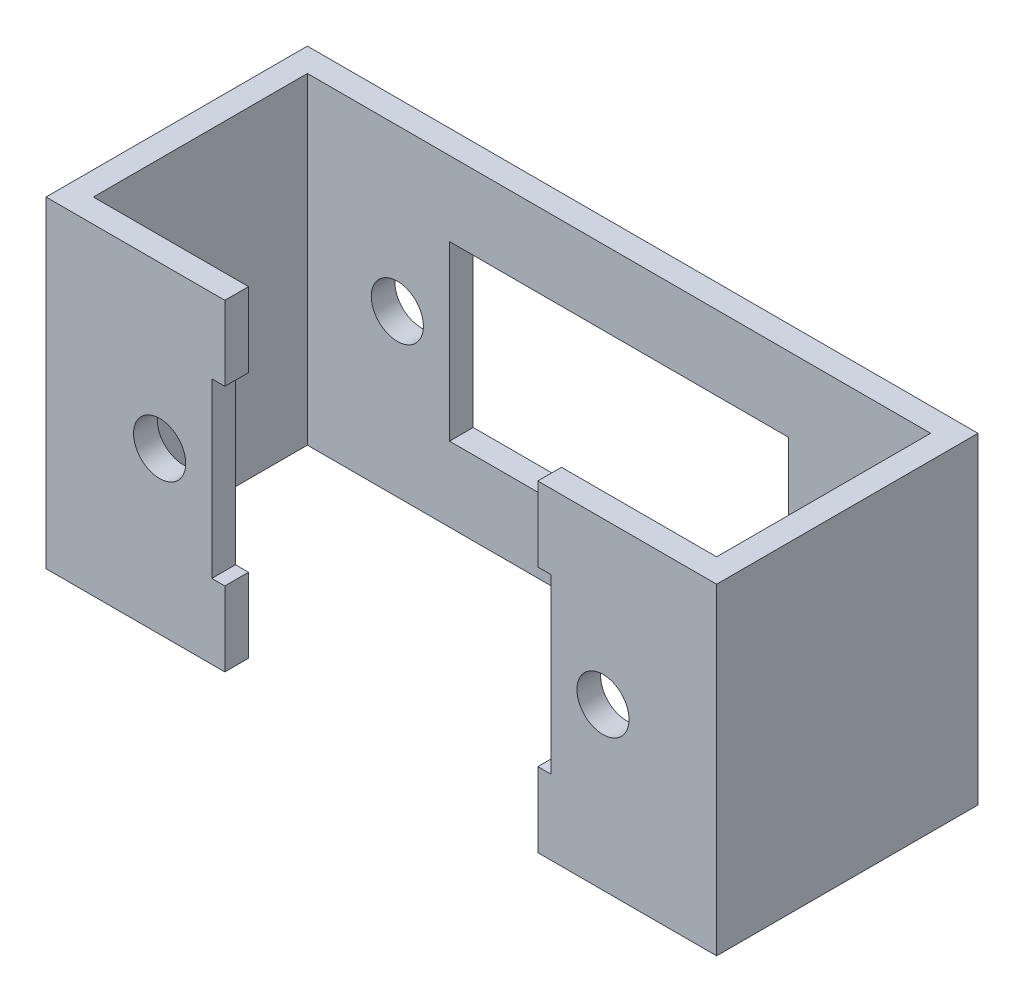
ISO-10303-21;
HEADER;
FILE_DESCRIPTION(('STEP AP214'),'2;1');
FILE_NAME('part.step','',(''),(''),'','','');
FILE_SCHEMA(('AUTOMOTIVE_DESIGN { 1 0 10303 214 1 1 1 1 }'));
ENDSEC;
DATA;
#1=APPLICATION_CONTEXT('core data for automotive mechanical design processes');
#2=APPLICATION_PROTOCOL_DEFINITION('international standard','automotive_design',2000,#1);
#3=PRODUCT_CONTEXT('',#1,'mechanical');
#4=PRODUCT('Part','Part','',(#3));
#5=PRODUCT_RELATED_PRODUCT_CATEGORY('part','',(#4));
#6=PRODUCT_DEFINITION_FORMATION('','',#4);
#7=PRODUCT_DEFINITION_CONTEXT('part definition',#1,'design');
#8=PRODUCT_DEFINITION('design','',#6,#7);
#9=PRODUCT_DEFINITION_SHAPE('','',#8);
#10=(LENGTH_UNIT() NAMED_UNIT(*) SI_UNIT(.MILLI.,.METRE.));
#11=(NAMED_UNIT(*) PLANE_ANGLE_UNIT() SI_UNIT($,.RADIAN.));
#12=(NAMED_UNIT(*) SI_UNIT($,.STERADIAN.) SOLID_ANGLE_UNIT());
#13=UNCERTAINTY_MEASURE_WITH_UNIT(LENGTH_MEASURE(1.E-05),#10,'distance_accuracy_value','');
#14=(GEOMETRIC_REPRESENTATION_CONTEXT(3) GLOBAL_UNCERTAINTY_ASSIGNED_CONTEXT((#13)) GLOBAL_UNIT_ASSIGNED_CONTEXT((#10,
#11,#12)) REPRESENTATION_CONTEXT('',''));
#15=CARTESIAN_POINT('',(0.,0.,0.));
#16=DIRECTION('',(0.,0.,1.));
#17=DIRECTION('',(1.,0.,0.));
#18=AXIS2_PLACEMENT_3D('',#15,#16,#17);
#19=CARTESIAN_POINT('',(-10.5,21.6,15.95));
#20=DIRECTION('',(-1.,0.,0.));
#21=DIRECTION('',(0.,0.,1.));
#22=AXIS2_PLACEMENT_3D('',#19,#20,#21);
#23=PLANE('',#22);
#24=DIRECTION('',(0.,-1.,0.));
#25=VECTOR('',#24,1.);
#26=CARTESIAN_POINT('',(-10.5,21.6,15.95));
#27=LINE('',#26,#25);
#28=CARTESIAN_POINT('',(-10.5,5.,15.95));
#29=VERTEX_POINT('',#28);
#30=CARTESIAN_POINT('',(-10.5,0.,15.95));
#31=VERTEX_POINT('',#30);
#32=EDGE_CURVE('E367',#29,#31,#27,.T.);
#33=ORIENTED_EDGE('',*,*,#32,.F.);
#34=DIRECTION('',(0.,0.,1.));
#35=VECTOR('',#34,1.);
#36=CARTESIAN_POINT('',(-10.5,5.,15.95));
#37=LINE('',#36,#35);
#38=CARTESIAN_POINT('',(-10.5,5.,17.54));
#39=VERTEX_POINT('',#38);
#40=EDGE_CURVE('E269',#29,#39,#37,.T.);
#41=ORIENTED_EDGE('',*,*,#40,.T.);
#42=DIRECTION('',(0.,-1.,0.));
#43=VECTOR('',#42,1.);
#44=CARTESIAN_POINT('',(-10.5,21.6,17.54));
#45=LINE('',#44,#43);
#46=CARTESIAN_POINT('',(-10.5,0.,17.54));
#47=VERTEX_POINT('',#46);
#48=EDGE_CURVE('E370',#39,#47,#45,.T.);
#49=ORIENTED_EDGE('',*,*,#48,.T.);
#50=DIRECTION('',(0.,0.,-1.));
#51=VECTOR('',#50,1.);
#52=CARTESIAN_POINT('',(-10.5,0.,15.95));
#53=LINE('',#52,#51);
#54=EDGE_CURVE('E317',#47,#31,#53,.T.);
#55=ORIENTED_EDGE('',*,*,#54,.T.);
#56=EDGE_LOOP('',(#33,#41,#49,#55));
#57=FACE_BOUND('',#56,.T.);
#58=ADVANCED_FACE('F32',(#57),#23,.F.);
#59=CARTESIAN_POINT('',(10.5,21.6,17.54));
#60=DIRECTION('',(1.,0.,0.));
#61=DIRECTION('',(0.,0.,-1.));
#62=AXIS2_PLACEMENT_3D('',#59,#60,#61);
#63=PLANE('',#62);
#64=DIRECTION('',(0.,-1.,0.));
#65=VECTOR('',#64,1.);
#66=CARTESIAN_POINT('',(10.5,21.6,17.54));
#67=LINE('',#66,#65);
#68=CARTESIAN_POINT('',(10.5,5.,17.54));
#69=VERTEX_POINT('',#68);
#70=CARTESIAN_POINT('',(10.5,0.,17.54));
#71=VERTEX_POINT('',#70);
#72=EDGE_CURVE('E347',#69,#71,#67,.T.);
#73=ORIENTED_EDGE('',*,*,#72,.F.);
#74=DIRECTION('',(0.,0.,-1.));
#75=VECTOR('',#74,1.);
#76=CARTESIAN_POINT('',(10.5,5.,17.54));
#77=LINE('',#76,#75);
#78=CARTESIAN_POINT('',(10.5,5.,15.95));
#79=VERTEX_POINT('',#78);
#80=EDGE_CURVE('E257',#69,#79,#77,.T.);
#81=ORIENTED_EDGE('',*,*,#80,.T.);
#82=DIRECTION('',(0.,-1.,0.));
#83=VECTOR('',#82,1.);
#84=CARTESIAN_POINT('',(10.5,21.6,15.95));
#85=LINE('',#84,#83);
#86=CARTESIAN_POINT('',(10.5,0.,15.95));
#87=VERTEX_POINT('',#86);
#88=EDGE_CURVE('E351',#79,#87,#85,.T.);
#89=ORIENTED_EDGE('',*,*,#88,.T.);
#90=DIRECTION('',(0.,0.,1.));
#91=VECTOR('',#90,1.);
#92=CARTESIAN_POINT('',(10.5,0.,17.54));
#93=LINE('',#92,#91);
#94=EDGE_CURVE('E331',#87,#71,#93,.T.);
#95=ORIENTED_EDGE('',*,*,#94,.T.);
#96=EDGE_LOOP('',(#73,#81,#89,#95));
#97=FACE_BOUND('',#96,.T.);
#98=ADVANCED_FACE('F430',(#97),#63,.F.);
#99=CARTESIAN_POINT('',(-22.5,21.6,17.54));
#100=DIRECTION('',(1.,0.,0.));
#101=DIRECTION('',(0.,0.,-1.));
#102=AXIS2_PLACEMENT_3D('',#99,#100,#101);
#103=PLANE('',#102);
#104=DIRECTION('',(0.,0.,1.));
#105=VECTOR('',#104,1.);
#106=CARTESIAN_POINT('',(-22.5,0.,17.54));
#107=LINE('',#106,#105);
#108=CARTESIAN_POINT('',(-22.5,0.,0.));
#109=VERTEX_POINT('',#108);
#110=CARTESIAN_POINT('',(-22.5,0.,17.54));
#111=VERTEX_POINT('',#110);
#112=EDGE_CURVE('E284',#109,#111,#107,.T.);
#113=ORIENTED_EDGE('',*,*,#112,.T.);
#114=DIRECTION('',(0.,-1.,0.));
#115=VECTOR('',#114,1.);
#116=CARTESIAN_POINT('',(-22.5,21.6,17.54));
#117=LINE('',#116,#115);
#118=CARTESIAN_POINT('',(-22.5,21.6,17.54));
#119=VERTEX_POINT('',#118);
#120=EDGE_CURVE('E11',#119,#111,#117,.T.);
#121=ORIENTED_EDGE('',*,*,#120,.F.);
#122=DIRECTION('',(0.,0.,1.));
#123=VECTOR('',#122,1.);
#124=CARTESIAN_POINT('',(-22.5,21.6,17.54));
#125=LINE('',#124,#123);
#126=CARTESIAN_POINT('',(-22.5,21.6,0.));
#127=VERTEX_POINT('',#126);
#128=EDGE_CURVE('E285',#127,#119,#125,.T.);
#129=ORIENTED_EDGE('',*,*,#128,.F.);
#130=DIRECTION('',(0.,-1.,0.));
#131=VECTOR('',#130,1.);
#132=CARTESIAN_POINT('',(-22.5,21.6,0.));
#133=LINE('',#132,#131);
#134=EDGE_CURVE('E311',#127,#109,#133,.T.);
#135=ORIENTED_EDGE('',*,*,#134,.T.);
#136=EDGE_LOOP('',(#113,#121,#129,#135));
#137=FACE_BOUND('',#136,.T.);
#138=ADVANCED_FACE('F34',(#137),#103,.F.);
#139=CARTESIAN_POINT('',(-10.5,21.6,17.54));
#140=DIRECTION('',(0.,0.,-1.));
#141=DIRECTION('',(-1.,0.,0.));
#142=AXIS2_PLACEMENT_3D('',#139,#140,#141);
#143=PLANE('',#142);
#144=CARTESIAN_POINT('',(-14.875,10.8,17.54));
#145=DIRECTION('',(0.,0.,-1.));
#146=DIRECTION('',(-1.,0.,0.));
#147=AXIS2_PLACEMENT_3D('',#144,#145,#146);
#148=CIRCLE('',#147,1.75);
#149=CARTESIAN_POINT('',(-16.625,10.8,17.54));
#150=VERTEX_POINT('',#149);
#151=EDGE_CURVE('E452',#150,#150,#148,.T.);
#152=ORIENTED_EDGE('',*,*,#151,.T.);
#153=EDGE_LOOP('',(#152));
#154=FACE_BOUND('',#153,.T.);
#155=ORIENTED_EDGE('',*,*,#48,.F.);
#156=DIRECTION('',(-1.,0.,0.));
#157=VECTOR('',#156,1.);
#158=CARTESIAN_POINT('',(-10.5,5.,17.54));
#159=LINE('',#158,#157);
#160=CARTESIAN_POINT('',(-11.375,5.,17.54));
#161=VERTEX_POINT('',#160);
#162=EDGE_CURVE('E272',#39,#161,#159,.T.);
#163=ORIENTED_EDGE('',*,*,#162,.T.);
#164=DIRECTION('',(0.,1.,0.));
#165=VECTOR('',#164,1.);
#166=CARTESIAN_POINT('',(-11.375,21.6,17.54));
#167=LINE('',#166,#165);
#168=CARTESIAN_POINT('',(-11.375,16.6,17.54));
#169=VERTEX_POINT('',#168);
#170=EDGE_CURVE('E281',#161,#169,#167,.T.);
#171=ORIENTED_EDGE('',*,*,#170,.T.);
#172=DIRECTION('',(1.,0.,0.));
#173=VECTOR('',#172,1.);
#174=CARTESIAN_POINT('',(-10.5,16.6,17.54));
#175=LINE('',#174,#173);
#176=CARTESIAN_POINT('',(-10.5,16.6,17.54));
#177=VERTEX_POINT('',#176);
#178=EDGE_CURVE('E244',#169,#177,#175,.T.);
#179=ORIENTED_EDGE('',*,*,#178,.T.);
#180=CARTESIAN_POINT('',(-10.5,21.6,17.54));
#181=VERTEX_POINT('',#180);
#182=EDGE_CURVE('E40',#181,#177,#45,.T.);
#183=ORIENTED_EDGE('',*,*,#182,.F.);
#184=DIRECTION('',(1.,0.,0.));
#185=VECTOR('',#184,1.);
#186=CARTESIAN_POINT('',(-10.5,21.6,17.54));
#187=LINE('',#186,#185);
#188=EDGE_CURVE('E288',#119,#181,#187,.T.);
#189=ORIENTED_EDGE('',*,*,#188,.F.);
#190=ORIENTED_EDGE('',*,*,#120,.T.);
#191=DIRECTION('',(1.,0.,0.));
#192=VECTOR('',#191,1.);
#193=CARTESIAN_POINT('',(-10.5,0.,17.54));
#194=LINE('',#193,#192);
#195=EDGE_CURVE('E314',#111,#47,#194,.T.);
#196=ORIENTED_EDGE('',*,*,#195,.T.);
#197=EDGE_LOOP('',(#155,#163,#171,#179,#183,#189,#190,#196));
#198=FACE_BOUND('',#197,.T.);
#199=ADVANCED_FACE('F381',(#154,#198),#143,.F.);
#200=ORIENTED_EDGE('',*,*,#182,.T.);
#201=DIRECTION('',(0.,0.,-1.));
#202=VECTOR('',#201,1.);
#203=CARTESIAN_POINT('',(-10.5,16.6,15.95));
#204=LINE('',#203,#202);
#205=CARTESIAN_POINT('',(-10.5,16.6,15.95));
#206=VERTEX_POINT('',#205);
#207=EDGE_CURVE('E241',#177,#206,#204,.T.);
#208=ORIENTED_EDGE('',*,*,#207,.T.);
#209=CARTESIAN_POINT('',(-10.5,21.6,15.95));
#210=VERTEX_POINT('',#209);
#211=EDGE_CURVE('E368',#210,#206,#27,.T.);
#212=ORIENTED_EDGE('',*,*,#211,.F.);
#213=DIRECTION('',(0.,0.,-1.));
#214=VECTOR('',#213,1.);
#215=CARTESIAN_POINT('',(-10.5,21.6,15.95));
#216=LINE('',#215,#214);
#217=EDGE_CURVE('E291',#181,#210,#216,.T.);
#218=ORIENTED_EDGE('',*,*,#217,.F.);
#219=EDGE_LOOP('',(#200,#208,#212,#218));
#220=FACE_BOUND('',#219,.T.);
#221=ADVANCED_FACE('F401',(#220),#23,.F.);
#222=CARTESIAN_POINT('',(-20.91,21.6,15.95));
#223=DIRECTION('',(0.,0.,1.));
#224=DIRECTION('',(1.,0.,0.));
#225=AXIS2_PLACEMENT_3D('',#222,#223,#224);
#226=PLANE('',#225);
#227=CARTESIAN_POINT('',(-14.875,10.8,15.95));
#228=DIRECTION('',(0.,0.,1.));
#229=DIRECTION('',(1.,0.,0.));
#230=AXIS2_PLACEMENT_3D('',#227,#228,#229);
#231=CIRCLE('',#230,1.75);
#232=CARTESIAN_POINT('',(-16.625,10.8,15.95));
#233=VERTEX_POINT('',#232);
#234=EDGE_CURVE('E455',#233,#233,#231,.T.);
#235=ORIENTED_EDGE('',*,*,#234,.T.);
#236=EDGE_LOOP('',(#235));
#237=FACE_BOUND('',#236,.T.);
#238=DIRECTION('',(0.,-1.,0.));
#239=VECTOR('',#238,1.);
#240=CARTESIAN_POINT('',(-11.375,21.6,15.95));
#241=LINE('',#240,#239);
#242=CARTESIAN_POINT('',(-11.375,16.6,15.95));
#243=VERTEX_POINT('',#242);
#244=CARTESIAN_POINT('',(-11.375,5.,15.95));
#245=VERTEX_POINT('',#244);
#246=EDGE_CURVE('E278',#243,#245,#241,.T.);
#247=ORIENTED_EDGE('',*,*,#246,.T.);
#248=DIRECTION('',(1.,0.,0.));
#249=VECTOR('',#248,1.);
#250=CARTESIAN_POINT('',(-20.91,5.,15.95));
#251=LINE('',#250,#249);
#252=EDGE_CURVE('E266',#245,#29,#251,.T.);
#253=ORIENTED_EDGE('',*,*,#252,.T.);
#254=ORIENTED_EDGE('',*,*,#32,.T.);
#255=DIRECTION('',(-1.,0.,0.));
#256=VECTOR('',#255,1.);
#257=CARTESIAN_POINT('',(-20.91,0.,15.95));
#258=LINE('',#257,#256);
#259=CARTESIAN_POINT('',(-20.91,0.,15.95));
#260=VERTEX_POINT('',#259);
#261=EDGE_CURVE('E320',#31,#260,#258,.T.);
#262=ORIENTED_EDGE('',*,*,#261,.T.);
#263=DIRECTION('',(0.,-1.,0.));
#264=VECTOR('',#263,1.);
#265=CARTESIAN_POINT('',(-20.91,21.6,15.95));
#266=LINE('',#265,#264);
#267=CARTESIAN_POINT('',(-20.91,21.6,15.95));
#268=VERTEX_POINT('',#267);
#269=EDGE_CURVE('E364',#268,#260,#266,.T.);
#270=ORIENTED_EDGE('',*,*,#269,.F.);
#271=DIRECTION('',(-1.,0.,0.));
#272=VECTOR('',#271,1.);
#273=CARTESIAN_POINT('',(-20.91,21.6,15.95));
#274=LINE('',#273,#272);
#275=EDGE_CURVE('E293',#210,#268,#274,.T.);
#276=ORIENTED_EDGE('',*,*,#275,.F.);
#277=ORIENTED_EDGE('',*,*,#211,.T.);
#278=DIRECTION('',(-1.,0.,0.));
#279=VECTOR('',#278,1.);
#280=CARTESIAN_POINT('',(-20.91,16.6,15.95));
#281=LINE('',#280,#279);
#282=EDGE_CURVE('E238',#206,#243,#281,.T.);
#283=ORIENTED_EDGE('',*,*,#282,.T.);
#284=EDGE_LOOP('',(#247,#253,#254,#262,#270,#276,#277,#283));
#285=FACE_BOUND('',#284,.T.);
#286=ADVANCED_FACE('F390',(#237,#285),#226,.F.);
#287=CARTESIAN_POINT('',(-20.91,21.6,1.59));
#288=DIRECTION('',(-1.,0.,0.));
#289=DIRECTION('',(0.,0.,1.));
#290=AXIS2_PLACEMENT_3D('',#287,#288,#289);
#291=PLANE('',#290);
#292=DIRECTION('',(0.,0.,-1.));
#293=VECTOR('',#292,1.);
#294=CARTESIAN_POINT('',(-20.91,0.,1.59));
#295=LINE('',#294,#293);
#296=CARTESIAN_POINT('',(-20.91,0.,1.59));
#297=VERTEX_POINT('',#296);
#298=EDGE_CURVE('E322',#260,#297,#295,.T.);
#299=ORIENTED_EDGE('',*,*,#298,.T.);
#300=DIRECTION('',(0.,-1.,0.));
#301=VECTOR('',#300,1.);
#302=CARTESIAN_POINT('',(-20.91,21.6,1.59));
#303=LINE('',#302,#301);
#304=CARTESIAN_POINT('',(-20.91,21.6,1.59));
#305=VERTEX_POINT('',#304);
#306=EDGE_CURVE('E361',#305,#297,#303,.T.);
#307=ORIENTED_EDGE('',*,*,#306,.F.);
#308=DIRECTION('',(0.,0.,-1.));
#309=VECTOR('',#308,1.);
#310=CARTESIAN_POINT('',(-20.91,21.6,1.59));
#311=LINE('',#310,#309);
#312=EDGE_CURVE('E295',#268,#305,#311,.T.);
#313=ORIENTED_EDGE('',*,*,#312,.F.);
#314=ORIENTED_EDGE('',*,*,#269,.T.);
#315=EDGE_LOOP('',(#299,#307,#313,#314));
#316=FACE_BOUND('',#315,.T.);
#317=ADVANCED_FACE('F394',(#316),#291,.F.);
#318=CARTESIAN_POINT('',(20.91,21.6,1.59));
#319=DIRECTION('',(0.,0.,-1.));
#320=DIRECTION('',(-1.,0.,0.));
#321=AXIS2_PLACEMENT_3D('',#318,#319,#320);
#322=PLANE('',#321);
#323=CARTESIAN_POINT('',(14.875,10.8,1.59));
#324=DIRECTION('',(0.,0.,-1.));
#325=DIRECTION('',(-1.,0.,0.));
#326=AXIS2_PLACEMENT_3D('',#323,#324,#325);
#327=CIRCLE('',#326,1.75);
#328=CARTESIAN_POINT('',(13.125,10.8,1.59));
#329=VERTEX_POINT('',#328);
#330=EDGE_CURVE('E467',#329,#329,#327,.T.);
#331=ORIENTED_EDGE('',*,*,#330,.T.);
#332=EDGE_LOOP('',(#331));
#333=FACE_BOUND('',#332,.T.);
#334=CARTESIAN_POINT('',(-14.875,10.8,1.59));
#335=DIRECTION('',(0.,0.,-1.));
#336=DIRECTION('',(-1.,0.,0.));
#337=AXIS2_PLACEMENT_3D('',#334,#335,#336);
#338=CIRCLE('',#337,1.75);
#339=CARTESIAN_POINT('',(-16.625,10.8,1.59));
#340=VERTEX_POINT('',#339);
#341=EDGE_CURVE('E461',#340,#340,#338,.T.);
#342=ORIENTED_EDGE('',*,*,#341,.T.);
#343=EDGE_LOOP('',(#342));
#344=FACE_BOUND('',#343,.T.);
#345=DIRECTION('',(-1.,0.,0.));
#346=VECTOR('',#345,1.);
#347=CARTESIAN_POINT('',(20.91,5.,1.59));
#348=LINE('',#347,#346);
#349=CARTESIAN_POINT('',(11.375,5.,1.59));
#350=VERTEX_POINT('',#349);
#351=CARTESIAN_POINT('',(-11.375,5.,1.59));
#352=VERTEX_POINT('',#351);
#353=EDGE_CURVE('E263',#350,#352,#348,.T.);
#354=ORIENTED_EDGE('',*,*,#353,.T.);
#355=DIRECTION('',(0.,1.,0.));
#356=VECTOR('',#355,1.);
#357=CARTESIAN_POINT('',(-11.375,21.6,1.59));
#358=LINE('',#357,#356);
#359=CARTESIAN_POINT('',(-11.375,16.6,1.59));
#360=VERTEX_POINT('',#359);
#361=EDGE_CURVE('E275',#352,#360,#358,.T.);
#362=ORIENTED_EDGE('',*,*,#361,.T.);
#363=DIRECTION('',(1.,0.,0.));
#364=VECTOR('',#363,1.);
#365=CARTESIAN_POINT('',(20.91,16.6,1.59));
#366=LINE('',#365,#364);
#367=CARTESIAN_POINT('',(11.375,16.6,1.59));
#368=VERTEX_POINT('',#367);
#369=EDGE_CURVE('E236',#360,#368,#366,.T.);
#370=ORIENTED_EDGE('',*,*,#369,.T.);
#371=DIRECTION('',(0.,-1.,0.));
#372=VECTOR('',#371,1.);
#373=CARTESIAN_POINT('',(11.375,21.6,1.59));
#374=LINE('',#373,#372);
#375=EDGE_CURVE('E198',#368,#350,#374,.T.);
#376=ORIENTED_EDGE('',*,*,#375,.T.);
#377=EDGE_LOOP('',(#354,#362,#370,#376));
#378=FACE_BOUND('',#377,.T.);
#379=DIRECTION('',(1.,0.,0.));
#380=VECTOR('',#379,1.);
#381=CARTESIAN_POINT('',(20.91,0.,1.59));
#382=LINE('',#381,#380);
#383=CARTESIAN_POINT('',(20.91,0.,1.59));
#384=VERTEX_POINT('',#383);
#385=EDGE_CURVE('E324',#297,#384,#382,.T.);
#386=ORIENTED_EDGE('',*,*,#385,.T.);
#387=DIRECTION('',(0.,-1.,0.));
#388=VECTOR('',#387,1.);
#389=CARTESIAN_POINT('',(20.91,21.6,1.59));
#390=LINE('',#389,#388);
#391=CARTESIAN_POINT('',(20.91,21.6,1.59));
#392=VERTEX_POINT('',#391);
#393=EDGE_CURVE('E358',#392,#384,#390,.T.);
#394=ORIENTED_EDGE('',*,*,#393,.F.);
#395=DIRECTION('',(1.,0.,0.));
#396=VECTOR('',#395,1.);
#397=CARTESIAN_POINT('',(20.91,21.6,1.59));
#398=LINE('',#397,#396);
#399=EDGE_CURVE('E297',#305,#392,#398,.T.);
#400=ORIENTED_EDGE('',*,*,#399,.F.);
#401=ORIENTED_EDGE('',*,*,#306,.T.);
#402=EDGE_LOOP('',(#386,#394,#400,#401));
#403=FACE_BOUND('',#402,.T.);
#404=ADVANCED_FACE('F472',(#333,#344,#378,#403),#322,.F.);
#405=CARTESIAN_POINT('',(20.91,21.6,15.95));
#406=DIRECTION('',(1.,0.,0.));
#407=DIRECTION('',(0.,0.,-1.));
#408=AXIS2_PLACEMENT_3D('',#405,#406,#407);
#409=PLANE('',#408);
#410=DIRECTION('',(0.,0.,1.));
#411=VECTOR('',#410,1.);
#412=CARTESIAN_POINT('',(20.91,0.,15.95));
#413=LINE('',#412,#411);
#414=CARTESIAN_POINT('',(20.91,0.,15.95));
#415=VERTEX_POINT('',#414);
#416=EDGE_CURVE('E326',#384,#415,#413,.T.);
#417=ORIENTED_EDGE('',*,*,#416,.T.);
#418=DIRECTION('',(0.,-1.,0.));
#419=VECTOR('',#418,1.);
#420=CARTESIAN_POINT('',(20.91,21.6,15.95));
#421=LINE('',#420,#419);
#422=CARTESIAN_POINT('',(20.91,21.6,15.95));
#423=VERTEX_POINT('',#422);
#424=EDGE_CURVE('E355',#423,#415,#421,.T.);
#425=ORIENTED_EDGE('',*,*,#424,.F.);
#426=DIRECTION('',(0.,0.,1.));
#427=VECTOR('',#426,1.);
#428=CARTESIAN_POINT('',(20.91,21.6,15.95));
#429=LINE('',#428,#427);
#430=EDGE_CURVE('E299',#392,#423,#429,.T.);
#431=ORIENTED_EDGE('',*,*,#430,.F.);
#432=ORIENTED_EDGE('',*,*,#393,.T.);
#433=EDGE_LOOP('',(#417,#425,#431,#432));
#434=FACE_BOUND('',#433,.T.);
#435=ADVANCED_FACE('F475',(#434),#409,.F.);
#436=CARTESIAN_POINT('',(10.5,21.6,15.95));
#437=DIRECTION('',(0.,0.,1.));
#438=DIRECTION('',(1.,0.,0.));
#439=AXIS2_PLACEMENT_3D('',#436,#437,#438);
#440=PLANE('',#439);
#441=CARTESIAN_POINT('',(14.875,10.8,15.95));
#442=DIRECTION('',(0.,0.,1.));
#443=DIRECTION('',(1.,0.,0.));
#444=AXIS2_PLACEMENT_3D('',#441,#442,#443);
#445=CIRCLE('',#444,1.75);
#446=CARTESIAN_POINT('',(16.625,10.8,15.95));
#447=VERTEX_POINT('',#446);
#448=EDGE_CURVE('E458',#447,#447,#445,.T.);
#449=ORIENTED_EDGE('',*,*,#448,.T.);
#450=EDGE_LOOP('',(#449));
#451=FACE_BOUND('',#450,.T.);
#452=ORIENTED_EDGE('',*,*,#88,.F.);
#453=DIRECTION('',(1.,0.,0.));
#454=VECTOR('',#453,1.);
#455=CARTESIAN_POINT('',(10.5,5.,15.95));
#456=LINE('',#455,#454);
#457=CARTESIAN_POINT('',(11.375,5.,15.95));
#458=VERTEX_POINT('',#457);
#459=EDGE_CURVE('E260',#79,#458,#456,.T.);
#460=ORIENTED_EDGE('',*,*,#459,.T.);
#461=DIRECTION('',(0.,1.,0.));
#462=VECTOR('',#461,1.);
#463=CARTESIAN_POINT('',(11.375,21.6,15.95));
#464=LINE('',#463,#462);
#465=CARTESIAN_POINT('',(11.375,16.6,15.95));
#466=VERTEX_POINT('',#465);
#467=EDGE_CURVE('E250',#458,#466,#464,.T.);
#468=ORIENTED_EDGE('',*,*,#467,.T.);
#469=DIRECTION('',(-1.,0.,0.));
#470=VECTOR('',#469,1.);
#471=CARTESIAN_POINT('',(10.5,16.6,15.95));
#472=LINE('',#471,#470);
#473=CARTESIAN_POINT('',(10.5,16.6,15.95));
#474=VERTEX_POINT('',#473);
#475=EDGE_CURVE('E233',#466,#474,#472,.T.);
#476=ORIENTED_EDGE('',*,*,#475,.T.);
#477=CARTESIAN_POINT('',(10.5,21.6,15.95));
#478=VERTEX_POINT('',#477);
#479=EDGE_CURVE('E352',#478,#474,#85,.T.);
#480=ORIENTED_EDGE('',*,*,#479,.F.);
#481=DIRECTION('',(-1.,0.,0.));
#482=VECTOR('',#481,1.);
#483=CARTESIAN_POINT('',(10.5,21.6,15.95));
#484=LINE('',#483,#482);
#485=EDGE_CURVE('E301',#423,#478,#484,.T.);
#486=ORIENTED_EDGE('',*,*,#485,.F.);
#487=ORIENTED_EDGE('',*,*,#424,.T.);
#488=DIRECTION('',(-1.,0.,0.));
#489=VECTOR('',#488,1.);
#490=CARTESIAN_POINT('',(10.5,0.,15.95));
#491=LINE('',#490,#489);
#492=EDGE_CURVE('E328',#415,#87,#491,.T.);
#493=ORIENTED_EDGE('',*,*,#492,.T.);
#494=EDGE_LOOP('',(#452,#460,#468,#476,#480,#486,#487,#493));
#495=FACE_BOUND('',#494,.T.);
#496=ADVANCED_FACE('F487',(#451,#495),#440,.F.);
#497=ORIENTED_EDGE('',*,*,#479,.T.);
#498=DIRECTION('',(0.,0.,1.));
#499=VECTOR('',#498,1.);
#500=CARTESIAN_POINT('',(10.5,16.6,17.54));
#501=LINE('',#500,#499);
#502=CARTESIAN_POINT('',(10.5,16.6,17.54));
#503=VERTEX_POINT('',#502);
#504=EDGE_CURVE('E230',#474,#503,#501,.T.);
#505=ORIENTED_EDGE('',*,*,#504,.T.);
#506=CARTESIAN_POINT('',(10.5,21.6,17.54));
#507=VERTEX_POINT('',#506);
#508=EDGE_CURVE('E348',#507,#503,#67,.T.);
#509=ORIENTED_EDGE('',*,*,#508,.F.);
#510=DIRECTION('',(0.,0.,1.));
#511=VECTOR('',#510,1.);
#512=CARTESIAN_POINT('',(10.5,21.6,17.54));
#513=LINE('',#512,#511);
#514=EDGE_CURVE('E303',#478,#507,#513,.T.);
#515=ORIENTED_EDGE('',*,*,#514,.F.);
#516=EDGE_LOOP('',(#497,#505,#509,#515));
#517=FACE_BOUND('',#516,.T.);
#518=ADVANCED_FACE('F437',(#517),#63,.F.);
#519=CARTESIAN_POINT('',(22.5,21.6,17.54));
#520=DIRECTION('',(0.,0.,-1.));
#521=DIRECTION('',(-1.,0.,0.));
#522=AXIS2_PLACEMENT_3D('',#519,#520,#521);
#523=PLANE('',#522);
#524=CARTESIAN_POINT('',(14.875,10.8,17.54));
#525=DIRECTION('',(0.,0.,-1.));
#526=DIRECTION('',(-1.,0.,0.));
#527=AXIS2_PLACEMENT_3D('',#524,#525,#526);
#528=CIRCLE('',#527,1.75);
#529=CARTESIAN_POINT('',(13.125,10.8,17.54));
#530=VERTEX_POINT('',#529);
#531=EDGE_CURVE('E454',#530,#530,#528,.T.);
#532=ORIENTED_EDGE('',*,*,#531,.T.);
#533=EDGE_LOOP('',(#532));
#534=FACE_BOUND('',#533,.T.);
#535=DIRECTION('',(0.,-1.,0.));
#536=VECTOR('',#535,1.);
#537=CARTESIAN_POINT('',(11.375,21.6,17.54));
#538=LINE('',#537,#536);
#539=CARTESIAN_POINT('',(11.375,16.6,17.54));
#540=VERTEX_POINT('',#539);
#541=CARTESIAN_POINT('',(11.375,5.,17.54));
#542=VERTEX_POINT('',#541);
#543=EDGE_CURVE('E247',#540,#542,#538,.T.);
#544=ORIENTED_EDGE('',*,*,#543,.T.);
#545=DIRECTION('',(-1.,0.,0.));
#546=VECTOR('',#545,1.);
#547=CARTESIAN_POINT('',(22.5,5.,17.54));
#548=LINE('',#547,#546);
#549=EDGE_CURVE('E254',#542,#69,#548,.T.);
#550=ORIENTED_EDGE('',*,*,#549,.T.);
#551=ORIENTED_EDGE('',*,*,#72,.T.);
#552=DIRECTION('',(1.,0.,0.));
#553=VECTOR('',#552,1.);
#554=CARTESIAN_POINT('',(22.5,0.,17.54));
#555=LINE('',#554,#553);
#556=CARTESIAN_POINT('',(22.5,0.,17.54));
#557=VERTEX_POINT('',#556);
#558=EDGE_CURVE('E334',#71,#557,#555,.T.);
#559=ORIENTED_EDGE('',*,*,#558,.T.);
#560=DIRECTION('',(0.,-1.,0.));
#561=VECTOR('',#560,1.);
#562=CARTESIAN_POINT('',(22.5,21.6,17.54));
#563=LINE('',#562,#561);
#564=CARTESIAN_POINT('',(22.5,21.6,17.54));
#565=VERTEX_POINT('',#564);
#566=EDGE_CURVE('E344',#565,#557,#563,.T.);
#567=ORIENTED_EDGE('',*,*,#566,.F.);
#568=DIRECTION('',(1.,0.,0.));
#569=VECTOR('',#568,1.);
#570=CARTESIAN_POINT('',(22.5,21.6,17.54));
#571=LINE('',#570,#569);
#572=EDGE_CURVE('E305',#507,#565,#571,.T.);
#573=ORIENTED_EDGE('',*,*,#572,.F.);
#574=ORIENTED_EDGE('',*,*,#508,.T.);
#575=DIRECTION('',(1.,0.,0.));
#576=VECTOR('',#575,1.);
#577=CARTESIAN_POINT('',(22.5,16.6,17.54));
#578=LINE('',#577,#576);
#579=EDGE_CURVE('E227',#503,#540,#578,.T.);
#580=ORIENTED_EDGE('',*,*,#579,.T.);
#581=EDGE_LOOP('',(#544,#550,#551,#559,#567,#573,#574,#580));
#582=FACE_BOUND('',#581,.T.);
#583=ADVANCED_FACE('F496',(#534,#582),#523,.F.);
#584=CARTESIAN_POINT('',(22.5,21.6,0.));
#585=DIRECTION('',(-1.,0.,0.));
#586=DIRECTION('',(0.,0.,1.));
#587=AXIS2_PLACEMENT_3D('',#584,#585,#586);
#588=PLANE('',#587);
#589=DIRECTION('',(0.,0.,-1.));
#590=VECTOR('',#589,1.);
#591=CARTESIAN_POINT('',(22.5,0.,0.));
#592=LINE('',#591,#590);
#593=CARTESIAN_POINT('',(22.5,0.,0.));
#594=VERTEX_POINT('',#593);
#595=EDGE_CURVE('E336',#557,#594,#592,.T.);
#596=ORIENTED_EDGE('',*,*,#595,.T.);
#597=DIRECTION('',(0.,-1.,0.));
#598=VECTOR('',#597,1.);
#599=CARTESIAN_POINT('',(22.5,21.6,0.));
#600=LINE('',#599,#598);
#601=CARTESIAN_POINT('',(22.5,21.6,0.));
#602=VERTEX_POINT('',#601);
#603=EDGE_CURVE('E341',#602,#594,#600,.T.);
#604=ORIENTED_EDGE('',*,*,#603,.F.);
#605=DIRECTION('',(0.,0.,-1.));
#606=VECTOR('',#605,1.);
#607=CARTESIAN_POINT('',(22.5,21.6,0.));
#608=LINE('',#607,#606);
#609=EDGE_CURVE('E307',#565,#602,#608,.T.);
#610=ORIENTED_EDGE('',*,*,#609,.F.);
#611=ORIENTED_EDGE('',*,*,#566,.T.);
#612=EDGE_LOOP('',(#596,#604,#610,#611));
#613=FACE_BOUND('',#612,.T.);
#614=ADVANCED_FACE('F501',(#613),#588,.F.);
#615=CARTESIAN_POINT('',(-22.5,21.6,0.));
#616=DIRECTION('',(0.,0.,1.));
#617=DIRECTION('',(1.,0.,0.));
#618=AXIS2_PLACEMENT_3D('',#615,#616,#617);
#619=PLANE('',#618);
#620=CARTESIAN_POINT('',(14.875,10.8,0.));
#621=DIRECTION('',(0.,0.,-1.));
#622=DIRECTION('',(-1.,0.,0.));
#623=AXIS2_PLACEMENT_3D('',#620,#621,#622);
#624=CIRCLE('',#623,1.75);
#625=CARTESIAN_POINT('',(13.125,10.8,0.));
#626=VERTEX_POINT('',#625);
#627=EDGE_CURVE('E714',#626,#626,#624,.T.);
#628=ORIENTED_EDGE('',*,*,#627,.F.);
#629=EDGE_LOOP('',(#628));
#630=FACE_BOUND('',#629,.T.);
#631=CARTESIAN_POINT('',(-14.875,10.8,0.));
#632=DIRECTION('',(0.,0.,-1.));
#633=DIRECTION('',(-1.,0.,0.));
#634=AXIS2_PLACEMENT_3D('',#631,#632,#633);
#635=CIRCLE('',#634,1.75);
#636=CARTESIAN_POINT('',(-16.625,10.8,0.));
#637=VERTEX_POINT('',#636);
#638=EDGE_CURVE('E720',#637,#637,#635,.T.);
#639=ORIENTED_EDGE('',*,*,#638,.F.);
#640=EDGE_LOOP('',(#639));
#641=FACE_BOUND('',#640,.T.);
#642=DIRECTION('',(1.,0.,0.));
#643=VECTOR('',#642,1.);
#644=CARTESIAN_POINT('',(11.375,16.6,0.));
#645=LINE('',#644,#643);
#646=CARTESIAN_POINT('',(-11.375,16.6,0.));
#647=VERTEX_POINT('',#646);
#648=CARTESIAN_POINT('',(11.375,16.6,0.));
#649=VERTEX_POINT('',#648);
#650=EDGE_CURVE('E204',#647,#649,#645,.T.);
#651=ORIENTED_EDGE('',*,*,#650,.F.);
#652=DIRECTION('',(0.,1.,0.));
#653=VECTOR('',#652,1.);
#654=CARTESIAN_POINT('',(-11.375,16.6,0.));
#655=LINE('',#654,#653);
#656=CARTESIAN_POINT('',(-11.375,5.,0.));
#657=VERTEX_POINT('',#656);
#658=EDGE_CURVE('E210',#657,#647,#655,.T.);
#659=ORIENTED_EDGE('',*,*,#658,.F.);
#660=DIRECTION('',(-1.,0.,0.));
#661=VECTOR('',#660,1.);
#662=CARTESIAN_POINT('',(11.375,5.,0.));
#663=LINE('',#662,#661);
#664=CARTESIAN_POINT('',(11.375,5.,0.));
#665=VERTEX_POINT('',#664);
#666=EDGE_CURVE('E215',#665,#657,#663,.T.);
#667=ORIENTED_EDGE('',*,*,#666,.F.);
#668=DIRECTION('',(0.,-1.,0.));
#669=VECTOR('',#668,1.);
#670=CARTESIAN_POINT('',(11.375,16.6,0.));
#671=LINE('',#670,#669);
#672=EDGE_CURVE('E195',#649,#665,#671,.T.);
#673=ORIENTED_EDGE('',*,*,#672,.F.);
#674=EDGE_LOOP('',(#651,#659,#667,#673));
#675=FACE_BOUND('',#674,.T.);
#676=DIRECTION('',(-1.,0.,0.));
#677=VECTOR('',#676,1.);
#678=CARTESIAN_POINT('',(-22.5,0.,0.));
#679=LINE('',#678,#677);
#680=EDGE_CURVE('E289',#594,#109,#679,.T.);
#681=ORIENTED_EDGE('',*,*,#680,.T.);
#682=ORIENTED_EDGE('',*,*,#134,.F.);
#683=DIRECTION('',(-1.,0.,0.));
#684=VECTOR('',#683,1.);
#685=CARTESIAN_POINT('',(-22.5,21.6,0.));
#686=LINE('',#685,#684);
#687=EDGE_CURVE('E309',#602,#127,#686,.T.);
#688=ORIENTED_EDGE('',*,*,#687,.F.);
#689=ORIENTED_EDGE('',*,*,#603,.T.);
#690=EDGE_LOOP('',(#681,#682,#688,#689));
#691=FACE_BOUND('',#690,.T.);
#692=ADVANCED_FACE('F212',(#630,#641,#675,#691),#619,.F.);
#693=CARTESIAN_POINT('',(0.,21.6,0.));
#694=DIRECTION('',(0.,-1.,0.));
#695=DIRECTION('',(0.,0.,-1.));
#696=AXIS2_PLACEMENT_3D('',#693,#694,#695);
#697=PLANE('',#696);
#698=ORIENTED_EDGE('',*,*,#128,.T.);
#699=ORIENTED_EDGE('',*,*,#188,.T.);
#700=ORIENTED_EDGE('',*,*,#217,.T.);
#701=ORIENTED_EDGE('',*,*,#275,.T.);
#702=ORIENTED_EDGE('',*,*,#312,.T.);
#703=ORIENTED_EDGE('',*,*,#399,.T.);
#704=ORIENTED_EDGE('',*,*,#430,.T.);
#705=ORIENTED_EDGE('',*,*,#485,.T.);
#706=ORIENTED_EDGE('',*,*,#514,.T.);
#707=ORIENTED_EDGE('',*,*,#572,.T.);
#708=ORIENTED_EDGE('',*,*,#609,.T.);
#709=ORIENTED_EDGE('',*,*,#687,.T.);
#710=EDGE_LOOP('',(#698,#699,#700,#701,#702,#703,#704,#705,#706,#707,#708,#709));
#711=FACE_BOUND('',#710,.T.);
#712=ADVANCED_FACE('F398',(#711),#697,.F.);
#713=CARTESIAN_POINT('',(0.,0.,0.));
#714=DIRECTION('',(0.,-1.,0.));
#715=DIRECTION('',(0.,0.,-1.));
#716=AXIS2_PLACEMENT_3D('',#713,#714,#715);
#717=PLANE('',#716);
#718=ORIENTED_EDGE('',*,*,#112,.F.);
#719=ORIENTED_EDGE('',*,*,#680,.F.);
#720=ORIENTED_EDGE('',*,*,#595,.F.);
#721=ORIENTED_EDGE('',*,*,#558,.F.);
#722=ORIENTED_EDGE('',*,*,#94,.F.);
#723=ORIENTED_EDGE('',*,*,#492,.F.);
#724=ORIENTED_EDGE('',*,*,#416,.F.);
#725=ORIENTED_EDGE('',*,*,#385,.F.);
#726=ORIENTED_EDGE('',*,*,#298,.F.);
#727=ORIENTED_EDGE('',*,*,#261,.F.);
#728=ORIENTED_EDGE('',*,*,#54,.F.);
#729=ORIENTED_EDGE('',*,*,#195,.F.);
#730=EDGE_LOOP('',(#718,#719,#720,#721,#722,#723,#724,#725,#726,#727,#728,#729));
#731=FACE_BOUND('',#730,.T.);
#732=ADVANCED_FACE('F385',(#731),#717,.T.);
#733=CARTESIAN_POINT('',(11.375,16.6,20.));
#734=DIRECTION('',(0.,1.,0.));
#735=DIRECTION('',(-1.,0.,0.));
#736=AXIS2_PLACEMENT_3D('',#733,#734,#735);
#737=PLANE('',#736);
#738=DIRECTION('',(0.,0.,-1.));
#739=VECTOR('',#738,1.);
#740=CARTESIAN_POINT('',(-11.375,16.6,20.));
#741=LINE('',#740,#739);
#742=EDGE_CURVE('E207',#360,#647,#741,.T.);
#743=ORIENTED_EDGE('',*,*,#742,.T.);
#744=ORIENTED_EDGE('',*,*,#650,.T.);
#745=DIRECTION('',(0.,0.,-1.));
#746=VECTOR('',#745,1.);
#747=CARTESIAN_POINT('',(11.375,16.6,20.));
#748=LINE('',#747,#746);
#749=EDGE_CURVE('E55',#368,#649,#748,.T.);
#750=ORIENTED_EDGE('',*,*,#749,.F.);
#751=ORIENTED_EDGE('',*,*,#369,.F.);
#752=EDGE_LOOP('',(#743,#744,#750,#751));
#753=FACE_BOUND('',#752,.T.);
#754=ADVANCED_FACE('F205',(#753),#737,.F.);
#755=CARTESIAN_POINT('',(11.375,16.6,20.));
#756=DIRECTION('',(1.,0.,0.));
#757=DIRECTION('',(0.,0.,-1.));
#758=AXIS2_PLACEMENT_3D('',#755,#756,#757);
#759=PLANE('',#758);
#760=ORIENTED_EDGE('',*,*,#749,.T.);
#761=ORIENTED_EDGE('',*,*,#672,.T.);
#762=DIRECTION('',(0.,0.,-1.));
#763=VECTOR('',#762,1.);
#764=CARTESIAN_POINT('',(11.375,5.,20.));
#765=LINE('',#764,#763);
#766=EDGE_CURVE('E224',#350,#665,#765,.T.);
#767=ORIENTED_EDGE('',*,*,#766,.F.);
#768=ORIENTED_EDGE('',*,*,#375,.F.);
#769=EDGE_LOOP('',(#760,#761,#767,#768));
#770=FACE_BOUND('',#769,.T.);
#771=ADVANCED_FACE('F192',(#770),#759,.F.);
#772=CARTESIAN_POINT('',(11.375,5.,20.));
#773=DIRECTION('',(0.,-1.,0.));
#774=DIRECTION('',(0.,0.,-1.));
#775=AXIS2_PLACEMENT_3D('',#772,#773,#774);
#776=PLANE('',#775);
#777=ORIENTED_EDGE('',*,*,#766,.T.);
#778=ORIENTED_EDGE('',*,*,#666,.T.);
#779=DIRECTION('',(0.,0.,-1.));
#780=VECTOR('',#779,1.);
#781=CARTESIAN_POINT('',(-11.375,5.,20.));
#782=LINE('',#781,#780);
#783=EDGE_CURVE('E220',#352,#657,#782,.T.);
#784=ORIENTED_EDGE('',*,*,#783,.F.);
#785=ORIENTED_EDGE('',*,*,#353,.F.);
#786=EDGE_LOOP('',(#777,#778,#784,#785));
#787=FACE_BOUND('',#786,.T.);
#788=ADVANCED_FACE('F411',(#787),#776,.F.);
#789=CARTESIAN_POINT('',(-11.375,16.6,20.));
#790=DIRECTION('',(-1.,0.,0.));
#791=DIRECTION('',(0.,0.,1.));
#792=AXIS2_PLACEMENT_3D('',#789,#790,#791);
#793=PLANE('',#792);
#794=ORIENTED_EDGE('',*,*,#783,.T.);
#795=ORIENTED_EDGE('',*,*,#658,.T.);
#796=ORIENTED_EDGE('',*,*,#742,.F.);
#797=ORIENTED_EDGE('',*,*,#361,.F.);
#798=EDGE_LOOP('',(#794,#795,#796,#797));
#799=FACE_BOUND('',#798,.T.);
#800=ADVANCED_FACE('F421',(#799),#793,.F.);
#801=EDGE_CURVE('E200',#540,#466,#748,.T.);
#802=ORIENTED_EDGE('',*,*,#801,.F.);
#803=ORIENTED_EDGE('',*,*,#579,.F.);
#804=ORIENTED_EDGE('',*,*,#504,.F.);
#805=ORIENTED_EDGE('',*,*,#475,.F.);
#806=EDGE_LOOP('',(#802,#803,#804,#805));
#807=FACE_BOUND('',#806,.T.);
#808=ADVANCED_FACE('F419',(#807),#737,.F.);
#809=EDGE_CURVE('E223',#542,#458,#765,.T.);
#810=ORIENTED_EDGE('',*,*,#809,.F.);
#811=ORIENTED_EDGE('',*,*,#543,.F.);
#812=ORIENTED_EDGE('',*,*,#801,.T.);
#813=ORIENTED_EDGE('',*,*,#467,.F.);
#814=EDGE_LOOP('',(#810,#811,#812,#813));
#815=FACE_BOUND('',#814,.T.);
#816=ADVANCED_FACE('F427',(#815),#759,.F.);
#817=ORIENTED_EDGE('',*,*,#80,.F.);
#818=ORIENTED_EDGE('',*,*,#549,.F.);
#819=ORIENTED_EDGE('',*,*,#809,.T.);
#820=ORIENTED_EDGE('',*,*,#459,.F.);
#821=EDGE_LOOP('',(#817,#818,#819,#820));
#822=FACE_BOUND('',#821,.T.);
#823=ADVANCED_FACE('F412',(#822),#776,.F.);
#824=EDGE_CURVE('E222',#161,#245,#782,.T.);
#825=ORIENTED_EDGE('',*,*,#824,.T.);
#826=ORIENTED_EDGE('',*,*,#246,.F.);
#827=EDGE_CURVE('E47',#169,#243,#741,.T.);
#828=ORIENTED_EDGE('',*,*,#827,.F.);
#829=ORIENTED_EDGE('',*,*,#170,.F.);
#830=EDGE_LOOP('',(#825,#826,#828,#829));
#831=FACE_BOUND('',#830,.T.);
#832=ADVANCED_FACE('F406',(#831),#793,.F.);
#833=ORIENTED_EDGE('',*,*,#40,.F.);
#834=ORIENTED_EDGE('',*,*,#252,.F.);
#835=ORIENTED_EDGE('',*,*,#824,.F.);
#836=ORIENTED_EDGE('',*,*,#162,.F.);
#837=EDGE_LOOP('',(#833,#834,#835,#836));
#838=FACE_BOUND('',#837,.T.);
#839=ADVANCED_FACE('F408',(#838),#776,.F.);
#840=ORIENTED_EDGE('',*,*,#827,.T.);
#841=ORIENTED_EDGE('',*,*,#282,.F.);
#842=ORIENTED_EDGE('',*,*,#207,.F.);
#843=ORIENTED_EDGE('',*,*,#178,.F.);
#844=EDGE_LOOP('',(#840,#841,#842,#843));
#845=FACE_BOUND('',#844,.T.);
#846=ADVANCED_FACE('F402',(#845),#737,.F.);
#847=CARTESIAN_POINT('',(-14.875,10.8,20.));
#848=DIRECTION('',(0.,0.,-1.));
#849=DIRECTION('',(-1.,0.,0.));
#850=AXIS2_PLACEMENT_3D('',#847,#848,#849);
#851=CYLINDRICAL_SURFACE('',#850,1.75);
#852=ORIENTED_EDGE('',*,*,#638,.T.);
#853=EDGE_LOOP('',(#852));
#854=FACE_BOUND('',#853,.T.);
#855=ORIENTED_EDGE('',*,*,#341,.F.);
#856=EDGE_LOOP('',(#855));
#857=FACE_BOUND('',#856,.T.);
#858=ADVANCED_FACE('F417',(#854,#857),#851,.F.);
#859=CARTESIAN_POINT('',(14.875,10.8,20.));
#860=DIRECTION('',(0.,0.,-1.));
#861=DIRECTION('',(-1.,0.,0.));
#862=AXIS2_PLACEMENT_3D('',#859,#860,#861);
#863=CYLINDRICAL_SURFACE('',#862,1.75);
#864=ORIENTED_EDGE('',*,*,#627,.T.);
#865=EDGE_LOOP('',(#864));
#866=FACE_BOUND('',#865,.T.);
#867=ORIENTED_EDGE('',*,*,#330,.F.);
#868=EDGE_LOOP('',(#867));
#869=FACE_BOUND('',#868,.T.);
#870=ADVANCED_FACE('F677',(#866,#869),#863,.F.);
#871=ORIENTED_EDGE('',*,*,#531,.F.);
#872=EDGE_LOOP('',(#871));
#873=FACE_BOUND('',#872,.T.);
#874=ORIENTED_EDGE('',*,*,#448,.F.);
#875=EDGE_LOOP('',(#874));
#876=FACE_BOUND('',#875,.T.);
#877=ADVANCED_FACE('F686',(#873,#876),#863,.F.);
#878=CARTESIAN_POINT('',(-16.625,10.8,15.95));
#879=CARTESIAN_POINT('',(-16.625,10.8,15.9665625));
#880=CARTESIAN_POINT('',(-16.625,10.8,15.983125));
#881=CARTESIAN_POINT('',(-16.625,10.8,16.01625));
#882=CARTESIAN_POINT('',(-16.625,10.8,16.0328125));
#883=CARTESIAN_POINT('',(-16.625,10.8,16.0659375));
#884=CARTESIAN_POINT('',(-16.625,10.8,16.0825));
#885=CARTESIAN_POINT('',(-16.625,10.8,16.115625));
#886=CARTESIAN_POINT('',(-16.625,10.8,16.1321875));
#887=CARTESIAN_POINT('',(-16.625,10.8,16.1653125));
#888=CARTESIAN_POINT('',(-16.625,10.8,16.181875));
#889=CARTESIAN_POINT('',(-16.625,10.8,16.215));
#890=CARTESIAN_POINT('',(-16.625,10.8,16.2315625));
#891=CARTESIAN_POINT('',(-16.625,10.8,16.2646875));
#892=CARTESIAN_POINT('',(-16.625,10.8,16.28125));
#893=CARTESIAN_POINT('',(-16.625,10.8,16.314375));
#894=CARTESIAN_POINT('',(-16.625,10.8,16.3309375));
#895=CARTESIAN_POINT('',(-16.625,10.8,16.3640625));
#896=CARTESIAN_POINT('',(-16.625,10.8,16.380625));
#897=CARTESIAN_POINT('',(-16.625,10.8,16.41375));
#898=CARTESIAN_POINT('',(-16.625,10.8,16.4303125));
#899=CARTESIAN_POINT('',(-16.625,10.8,16.4634375));
#900=CARTESIAN_POINT('',(-16.625,10.8,16.48));
#901=CARTESIAN_POINT('',(-16.625,10.8,16.513125));
#902=CARTESIAN_POINT('',(-16.625,10.8,16.5296875));
#903=CARTESIAN_POINT('',(-16.625,10.8,16.5628125));
#904=CARTESIAN_POINT('',(-16.625,10.8,16.579375));
#905=CARTESIAN_POINT('',(-16.625,10.8,16.6125));
#906=CARTESIAN_POINT('',(-16.625,10.8,16.6290625));
#907=CARTESIAN_POINT('',(-16.625,10.8,16.6621875));
#908=CARTESIAN_POINT('',(-16.625,10.8,16.67875));
#909=CARTESIAN_POINT('',(-16.625,10.8,16.711875));
#910=CARTESIAN_POINT('',(-16.625,10.8,16.7284375));
#911=CARTESIAN_POINT('',(-16.625,10.8,16.7615625));
#912=CARTESIAN_POINT('',(-16.625,10.8,16.778125));
#913=CARTESIAN_POINT('',(-16.625,10.8,16.81125));
#914=CARTESIAN_POINT('',(-16.625,10.8,16.8278125));
#915=CARTESIAN_POINT('',(-16.625,10.8,16.8609375));
#916=CARTESIAN_POINT('',(-16.625,10.8,16.8775));
#917=CARTESIAN_POINT('',(-16.625,10.8,16.910625));
#918=CARTESIAN_POINT('',(-16.625,10.8,16.9271875));
#919=CARTESIAN_POINT('',(-16.625,10.8,16.9603125));
#920=CARTESIAN_POINT('',(-16.625,10.8,16.976875));
#921=CARTESIAN_POINT('',(-16.625,10.8,17.01));
#922=CARTESIAN_POINT('',(-16.625,10.8,17.0265625));
#923=CARTESIAN_POINT('',(-16.625,10.8,17.0596875));
#924=CARTESIAN_POINT('',(-16.625,10.8,17.07625));
#925=CARTESIAN_POINT('',(-16.625,10.8,17.109375));
#926=CARTESIAN_POINT('',(-16.625,10.8,17.1259375));
#927=CARTESIAN_POINT('',(-16.625,10.8,17.1590625));
#928=CARTESIAN_POINT('',(-16.625,10.8,17.175625));
#929=CARTESIAN_POINT('',(-16.625,10.8,17.20875));
#930=CARTESIAN_POINT('',(-16.625,10.8,17.2253125));
#931=CARTESIAN_POINT('',(-16.625,10.8,17.2584375));
#932=CARTESIAN_POINT('',(-16.625,10.8,17.275));
#933=CARTESIAN_POINT('',(-16.625,10.8,17.308125));
#934=CARTESIAN_POINT('',(-16.625,10.8,17.3246875));
#935=CARTESIAN_POINT('',(-16.625,10.8,17.3578125));
#936=CARTESIAN_POINT('',(-16.625,10.8,17.374375));
#937=CARTESIAN_POINT('',(-16.625,10.8,17.4075));
#938=CARTESIAN_POINT('',(-16.625,10.8,17.4240625));
#939=CARTESIAN_POINT('',(-16.625,10.8,17.4571875));
#940=CARTESIAN_POINT('',(-16.625,10.8,17.47375));
#941=CARTESIAN_POINT('',(-16.625,10.8,17.506875));
#942=CARTESIAN_POINT('',(-16.625,10.8,17.5234375));
#943=CARTESIAN_POINT('',(-16.625,10.8,17.54));
#944=B_SPLINE_CURVE_WITH_KNOTS('',3,(#878,#879,#880,#881,#882,#883,#884,#885,#886,#887,#888,
#889,#890,#891,#892,#893,#894,#895,#896,#897,#898,#899,#900,#901,#902,#903,#904,#905,#906,#907,
#908,#909,#910,#911,#912,#913,#914,#915,#916,#917,#918,#919,#920,#921,#922,#923,#924,#925,#926,
#927,#928,#929,#930,#931,#932,#933,#934,#935,#936,#937,#938,#939,#940,#941,#942,#943),
.UNSPECIFIED.,.F.,.F.,(4,2,2,2,2,2,2,2,2,2,2,2,2,2,2,2,2,2,2,2,2,2,2,2,2,2,2,2,2,2,2,2,4),(0.,
0.0496874999999994,0.0993749999999988,0.149062499999998,0.198749999999998,0.2484375,0.298125,
0.347812499999999,0.397499999999999,0.447187500000001,0.496875000000001,0.5465625,0.59625,
0.645937499999999,0.695624999999998,0.745312500000001,0.795000000000001,0.8446875,
0.894375000000003,0.944062500000002,0.993750000000002,1.0434375,1.093125,1.1428125,1.1925,
1.2421875,1.291875,1.3415625,1.39125,1.4409375,1.490625,1.5403125,1.59),.UNSPECIFIED.);
#945=EDGE_CURVE('BSEAM679',#233,#150,#944,.T.);
#946=ORIENTED_EDGE('',*,*,#234,.F.);
#947=ORIENTED_EDGE('',*,*,#151,.F.);
#948=ORIENTED_EDGE('',*,*,#945,.T.);
#949=ORIENTED_EDGE('',*,*,#945,.F.);
#950=EDGE_LOOP('',(#946,#948,#947,#949));
#951=FACE_BOUND('',#950,.T.);
#952=ADVANCED_FACE('F679',(#951),#851,.F.);
#953=CLOSED_SHELL('',(#58,#98,#138,#199,#221,#286,#317,#404,#435,#496,#518,#583,#614,#692,#712,
#732,#754,#771,#788,#800,#808,#816,#823,#832,#839,#846,#858,#870,#877,#952));
#954=MANIFOLD_SOLID_BREP('B2',#953);
#955=ADVANCED_BREP_SHAPE_REPRESENTATION('',(#18,#954),#14);
#956=SHAPE_DEFINITION_REPRESENTATION(#9,#955);
ENDSEC;
END-ISO-10303-21;
